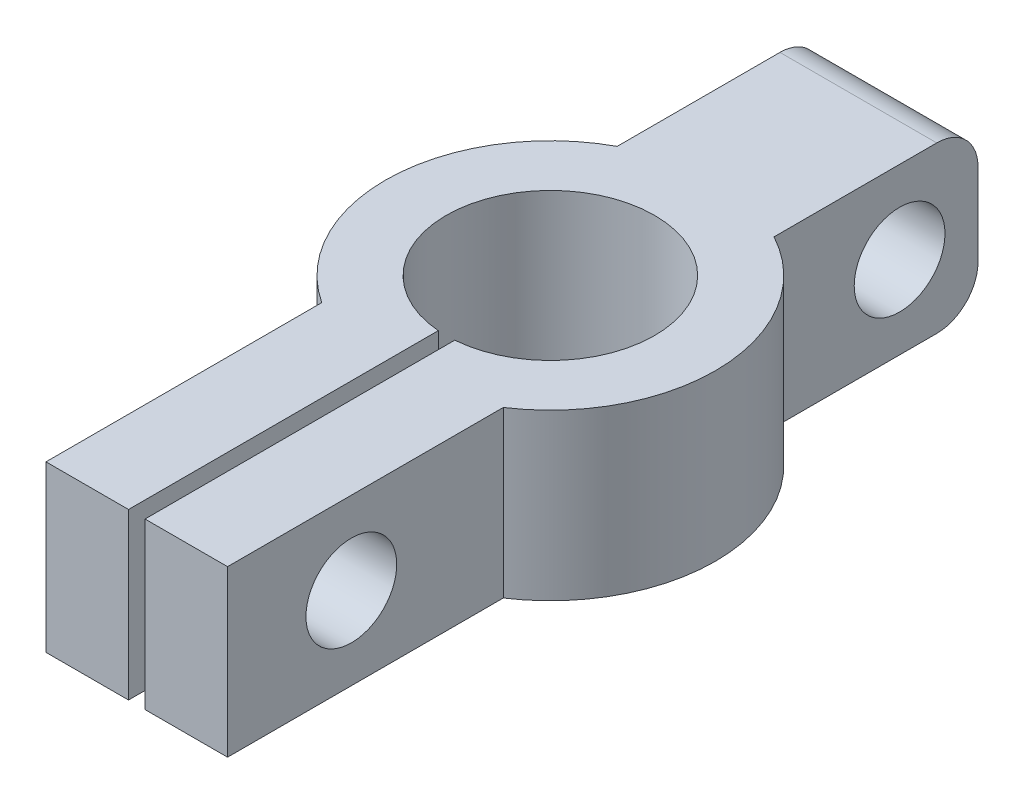
ISO-10303-21;
HEADER;
FILE_DESCRIPTION(('STEP AP214'),'2;1');
FILE_NAME('part.step','',(''),(''),'','','');
FILE_SCHEMA(('AUTOMOTIVE_DESIGN { 1 0 10303 214 1 1 1 1 }'));
ENDSEC;
DATA;
#1=APPLICATION_CONTEXT('core data for automotive mechanical design processes');
#2=APPLICATION_PROTOCOL_DEFINITION('international standard','automotive_design',2000,#1);
#3=PRODUCT_CONTEXT('',#1,'mechanical');
#4=PRODUCT('Part','Part','',(#3));
#5=PRODUCT_RELATED_PRODUCT_CATEGORY('part','',(#4));
#6=PRODUCT_DEFINITION_FORMATION('','',#4);
#7=PRODUCT_DEFINITION_CONTEXT('part definition',#1,'design');
#8=PRODUCT_DEFINITION('design','',#6,#7);
#9=PRODUCT_DEFINITION_SHAPE('','',#8);
#10=(LENGTH_UNIT() NAMED_UNIT(*) SI_UNIT(.MILLI.,.METRE.));
#11=(NAMED_UNIT(*) PLANE_ANGLE_UNIT() SI_UNIT($,.RADIAN.));
#12=(NAMED_UNIT(*) SI_UNIT($,.STERADIAN.) SOLID_ANGLE_UNIT());
#13=UNCERTAINTY_MEASURE_WITH_UNIT(LENGTH_MEASURE(1.E-05),#10,'distance_accuracy_value','');
#14=(GEOMETRIC_REPRESENTATION_CONTEXT(3) GLOBAL_UNCERTAINTY_ASSIGNED_CONTEXT((#13)) GLOBAL_UNIT_ASSIGNED_CONTEXT((#10,
#11,#12)) REPRESENTATION_CONTEXT('',''));
#15=CARTESIAN_POINT('',(0.,0.,0.));
#16=DIRECTION('',(0.,0.,1.));
#17=DIRECTION('',(1.,0.,0.));
#18=AXIS2_PLACEMENT_3D('',#15,#16,#17);
#19=CARTESIAN_POINT('',(-2.55711710439935,4.,0.));
#20=DIRECTION('',(-1.,0.,0.));
#21=DIRECTION('',(0.,0.,1.));
#22=AXIS2_PLACEMENT_3D('',#19,#20,#21);
#23=PLANE('',#22);
#24=CARTESIAN_POINT('',(-2.55711710439935,2.,-20.1393028746529));
#25=DIRECTION('',(-1.,0.,0.));
#26=DIRECTION('',(0.,0.,1.));
#27=AXIS2_PLACEMENT_3D('',#24,#25,#26);
#28=CIRCLE('',#27,1.1);
#29=CARTESIAN_POINT('',(-2.55711710439935,2.,-19.0393028746529));
#30=VERTEX_POINT('',#29);
#31=EDGE_CURVE('E190',#30,#30,#28,.T.);
#32=ORIENTED_EDGE('',*,*,#31,.T.);
#33=EDGE_LOOP('',(#32));
#34=FACE_BOUND('',#33,.T.);
#35=DIRECTION('',(0.,0.,-1.));
#36=VECTOR('',#35,1.);
#37=CARTESIAN_POINT('',(-2.55711710439935,0.,0.));
#38=LINE('',#37,#36);
#39=CARTESIAN_POINT('',(-2.55711710439935,0.,-17.0951444408748));
#40=VERTEX_POINT('',#39);
#41=CARTESIAN_POINT('',(-2.55711710439935,0.,-21.0393028746529));
#42=VERTEX_POINT('',#41);
#43=EDGE_CURVE('E187',#40,#42,#38,.T.);
#44=ORIENTED_EDGE('',*,*,#43,.T.);
#45=CARTESIAN_POINT('',(-2.55711710439935,1.,-21.0393028746529));
#46=DIRECTION('',(-1.,0.,0.));
#47=DIRECTION('',(0.,0.,1.));
#48=AXIS2_PLACEMENT_3D('',#45,#46,#47);
#49=CIRCLE('',#48,1.);
#50=CARTESIAN_POINT('',(-2.55711710439935,1.,-22.0393028746529));
#51=VERTEX_POINT('',#50);
#52=EDGE_CURVE('E251',#42,#51,#49,.F.);
#53=ORIENTED_EDGE('',*,*,#52,.T.);
#54=DIRECTION('',(0.,-1.,0.));
#55=VECTOR('',#54,1.);
#56=CARTESIAN_POINT('',(-2.55711710439935,4.,-22.0393028746529));
#57=LINE('',#56,#55);
#58=CARTESIAN_POINT('',(-2.55711710439935,3.,-22.0393028746529));
#59=VERTEX_POINT('',#58);
#60=EDGE_CURVE('E235',#59,#51,#57,.T.);
#61=ORIENTED_EDGE('',*,*,#60,.F.);
#62=CARTESIAN_POINT('',(-2.55711710439935,3.,-21.0393028746529));
#63=DIRECTION('',(-1.,0.,0.));
#64=DIRECTION('',(0.,0.,1.));
#65=AXIS2_PLACEMENT_3D('',#62,#63,#64);
#66=CIRCLE('',#65,1.);
#67=CARTESIAN_POINT('',(-2.55711710439935,4.,-21.0393028746529));
#68=VERTEX_POINT('',#67);
#69=EDGE_CURVE('E249',#59,#68,#66,.F.);
#70=ORIENTED_EDGE('',*,*,#69,.T.);
#71=DIRECTION('',(0.,0.,-1.));
#72=VECTOR('',#71,1.);
#73=CARTESIAN_POINT('',(-2.55711710439935,4.,0.));
#74=LINE('',#73,#72);
#75=CARTESIAN_POINT('',(-2.55711710439935,4.,-17.0951444408748));
#76=VERTEX_POINT('',#75);
#77=EDGE_CURVE('E150',#76,#68,#74,.T.);
#78=ORIENTED_EDGE('',*,*,#77,.F.);
#79=DIRECTION('',(0.,-1.,0.));
#80=VECTOR('',#79,1.);
#81=CARTESIAN_POINT('',(-2.55711710439935,4.,-17.0951444408748));
#82=LINE('',#81,#80);
#83=EDGE_CURVE('E186',#76,#40,#82,.T.);
#84=ORIENTED_EDGE('',*,*,#83,.T.);
#85=EDGE_LOOP('',(#44,#53,#61,#70,#78,#84));
#86=FACE_BOUND('',#85,.T.);
#87=ADVANCED_FACE('F43',(#34,#86),#23,.F.);
#88=CARTESIAN_POINT('',(0.,4.,-22.0393028746529));
#89=DIRECTION('',(0.,0.,-1.));
#90=DIRECTION('',(-1.,0.,0.));
#91=AXIS2_PLACEMENT_3D('',#88,#89,#90);
#92=PLANE('',#91);
#93=ORIENTED_EDGE('',*,*,#60,.T.);
#94=DIRECTION('',(1.,0.,0.));
#95=VECTOR('',#94,1.);
#96=CARTESIAN_POINT('',(-6.35711710439935,1.,-22.0393028746529));
#97=LINE('',#96,#95);
#98=CARTESIAN_POINT('',(-6.35711710439935,1.,-22.0393028746529));
#99=VERTEX_POINT('',#98);
#100=EDGE_CURVE('E64',#51,#99,#97,.F.);
#101=ORIENTED_EDGE('',*,*,#100,.T.);
#102=DIRECTION('',(0.,-1.,0.));
#103=VECTOR('',#102,1.);
#104=CARTESIAN_POINT('',(-6.35711710439935,4.,-22.0393028746529));
#105=LINE('',#104,#103);
#106=CARTESIAN_POINT('',(-6.35711710439935,3.,-22.0393028746529));
#107=VERTEX_POINT('',#106);
#108=EDGE_CURVE('E159',#107,#99,#105,.T.);
#109=ORIENTED_EDGE('',*,*,#108,.F.);
#110=DIRECTION('',(1.,0.,0.));
#111=VECTOR('',#110,1.);
#112=CARTESIAN_POINT('',(0.,3.,-22.0393028746529));
#113=LINE('',#112,#111);
#114=EDGE_CURVE('E253',#107,#59,#113,.T.);
#115=ORIENTED_EDGE('',*,*,#114,.T.);
#116=EDGE_LOOP('',(#93,#101,#109,#115));
#117=FACE_BOUND('',#116,.T.);
#118=ADVANCED_FACE('F268',(#117),#92,.T.);
#119=CARTESIAN_POINT('',(-6.35711710439935,4.,0.));
#120=DIRECTION('',(1.,0.,0.));
#121=DIRECTION('',(0.,0.,-1.));
#122=AXIS2_PLACEMENT_3D('',#119,#120,#121);
#123=PLANE('',#122);
#124=CARTESIAN_POINT('',(-6.35711710439935,2.,-20.1393028746529));
#125=DIRECTION('',(1.,0.,0.));
#126=DIRECTION('',(0.,0.,-1.));
#127=AXIS2_PLACEMENT_3D('',#124,#125,#126);
#128=CIRCLE('',#127,1.1);
#129=CARTESIAN_POINT('',(-6.35711710439935,2.,-21.2393028746529));
#130=VERTEX_POINT('',#129);
#131=EDGE_CURVE('E238',#130,#130,#128,.T.);
#132=ORIENTED_EDGE('',*,*,#131,.T.);
#133=EDGE_LOOP('',(#132));
#134=FACE_BOUND('',#133,.T.);
#135=ORIENTED_EDGE('',*,*,#108,.T.);
#136=CARTESIAN_POINT('',(-6.35711710439935,1.,-21.0393028746529));
#137=DIRECTION('',(1.,0.,0.));
#138=DIRECTION('',(0.,0.,-1.));
#139=AXIS2_PLACEMENT_3D('',#136,#137,#138);
#140=CIRCLE('',#139,1.);
#141=CARTESIAN_POINT('',(-6.35711710439935,0.,-21.0393028746529));
#142=VERTEX_POINT('',#141);
#143=EDGE_CURVE('E51',#99,#142,#140,.F.);
#144=ORIENTED_EDGE('',*,*,#143,.T.);
#145=DIRECTION('',(0.,0.,1.));
#146=VECTOR('',#145,1.);
#147=CARTESIAN_POINT('',(-6.35711710439935,0.,0.));
#148=LINE('',#147,#146);
#149=CARTESIAN_POINT('',(-6.35711710439935,0.,-17.0951444408748));
#150=VERTEX_POINT('',#149);
#151=EDGE_CURVE('E156',#142,#150,#148,.T.);
#152=ORIENTED_EDGE('',*,*,#151,.T.);
#153=DIRECTION('',(0.,-1.,0.));
#154=VECTOR('',#153,1.);
#155=CARTESIAN_POINT('',(-6.35711710439935,4.,-17.0951444408748));
#156=LINE('',#155,#154);
#157=CARTESIAN_POINT('',(-6.35711710439935,4.,-17.0951444408748));
#158=VERTEX_POINT('',#157);
#159=EDGE_CURVE('E153',#158,#150,#156,.T.);
#160=ORIENTED_EDGE('',*,*,#159,.F.);
#161=DIRECTION('',(0.,0.,1.));
#162=VECTOR('',#161,1.);
#163=CARTESIAN_POINT('',(-6.35711710439935,4.,0.));
#164=LINE('',#163,#162);
#165=CARTESIAN_POINT('',(-6.35711710439935,4.,-21.0393028746529));
#166=VERTEX_POINT('',#165);
#167=EDGE_CURVE('E142',#166,#158,#164,.T.);
#168=ORIENTED_EDGE('',*,*,#167,.F.);
#169=CARTESIAN_POINT('',(-6.35711710439935,3.,-21.0393028746529));
#170=DIRECTION('',(1.,0.,0.));
#171=DIRECTION('',(0.,0.,-1.));
#172=AXIS2_PLACEMENT_3D('',#169,#170,#171);
#173=CIRCLE('',#172,1.);
#174=EDGE_CURVE('E257',#166,#107,#173,.F.);
#175=ORIENTED_EDGE('',*,*,#174,.T.);
#176=EDGE_LOOP('',(#135,#144,#152,#160,#168,#175));
#177=FACE_BOUND('',#176,.T.);
#178=ADVANCED_FACE('F154',(#134,#177),#123,.F.);
#179=CARTESIAN_POINT('',(-4.45711710439935,4.,-13.5752012595152));
#180=DIRECTION('',(0.,-1.,0.));
#181=DIRECTION('',(0.,0.,-1.));
#182=AXIS2_PLACEMENT_3D('',#179,#180,#181);
#183=CYLINDRICAL_SURFACE('',#182,4.);
#184=CARTESIAN_POINT('',(-4.45711710439935,0.,-13.5752012595152));
#185=DIRECTION('',(0.,1.,0.));
#186=DIRECTION('',(0.,0.,1.));
#187=AXIS2_PLACEMENT_3D('',#184,#185,#186);
#188=CIRCLE('',#187,4.);
#189=CARTESIAN_POINT('',(-6.65711710439935,0.,-10.2345426418172));
#190=VERTEX_POINT('',#189);
#191=EDGE_CURVE('E192',#150,#190,#188,.T.);
#192=ORIENTED_EDGE('',*,*,#191,.T.);
#193=DIRECTION('',(0.,-1.,0.));
#194=VECTOR('',#193,1.);
#195=CARTESIAN_POINT('',(-6.65711710439935,4.,-10.2345426418172));
#196=LINE('',#195,#194);
#197=CARTESIAN_POINT('',(-6.65711710439935,4.,-10.2345426418172));
#198=VERTEX_POINT('',#197);
#199=EDGE_CURVE('E160',#198,#190,#196,.T.);
#200=ORIENTED_EDGE('',*,*,#199,.F.);
#201=CARTESIAN_POINT('',(-4.45711710439935,4.,-13.5752012595152));
#202=DIRECTION('',(0.,1.,0.));
#203=DIRECTION('',(0.,0.,1.));
#204=AXIS2_PLACEMENT_3D('',#201,#202,#203);
#205=CIRCLE('',#204,4.);
#206=EDGE_CURVE('E146',#158,#198,#205,.T.);
#207=ORIENTED_EDGE('',*,*,#206,.F.);
#208=ORIENTED_EDGE('',*,*,#159,.T.);
#209=EDGE_LOOP('',(#192,#200,#207,#208));
#210=FACE_BOUND('',#209,.T.);
#211=ADVANCED_FACE('F162',(#210),#183,.T.);
#212=CARTESIAN_POINT('',(-6.65711710439935,4.,0.));
#213=DIRECTION('',(1.,0.,0.));
#214=DIRECTION('',(0.,0.,-1.));
#215=AXIS2_PLACEMENT_3D('',#212,#213,#214);
#216=PLANE('',#215);
#217=CARTESIAN_POINT('',(-6.65711710439935,2.,-6.55143111261298));
#218=DIRECTION('',(-1.,0.,0.));
#219=DIRECTION('',(0.,0.,1.));
#220=AXIS2_PLACEMENT_3D('',#217,#218,#219);
#221=CIRCLE('',#220,1.1);
#222=CARTESIAN_POINT('',(-6.65711710439935,2.,-5.45143111261298));
#223=VERTEX_POINT('',#222);
#224=EDGE_CURVE('E246',#223,#223,#221,.T.);
#225=ORIENTED_EDGE('',*,*,#224,.F.);
#226=EDGE_LOOP('',(#225));
#227=FACE_BOUND('',#226,.T.);
#228=DIRECTION('',(0.,0.,1.));
#229=VECTOR('',#228,1.);
#230=CARTESIAN_POINT('',(-6.65711710439935,0.,0.));
#231=LINE('',#230,#229);
#232=CARTESIAN_POINT('',(-6.65711710439935,0.,-3.55143111261298));
#233=VERTEX_POINT('',#232);
#234=EDGE_CURVE('E194',#190,#233,#231,.T.);
#235=ORIENTED_EDGE('',*,*,#234,.T.);
#236=DIRECTION('',(0.,-1.,0.));
#237=VECTOR('',#236,1.);
#238=CARTESIAN_POINT('',(-6.65711710439935,4.,-3.55143111261298));
#239=LINE('',#238,#237);
#240=CARTESIAN_POINT('',(-6.65711710439935,4.,-3.55143111261298));
#241=VERTEX_POINT('',#240);
#242=EDGE_CURVE('E230',#241,#233,#239,.T.);
#243=ORIENTED_EDGE('',*,*,#242,.F.);
#244=DIRECTION('',(0.,0.,1.));
#245=VECTOR('',#244,1.);
#246=CARTESIAN_POINT('',(-6.65711710439935,4.,0.));
#247=LINE('',#246,#245);
#248=EDGE_CURVE('E165',#198,#241,#247,.T.);
#249=ORIENTED_EDGE('',*,*,#248,.F.);
#250=ORIENTED_EDGE('',*,*,#199,.T.);
#251=EDGE_LOOP('',(#235,#243,#249,#250));
#252=FACE_BOUND('',#251,.T.);
#253=ADVANCED_FACE('F287',(#227,#252),#216,.F.);
#254=CARTESIAN_POINT('',(0.,4.,-3.55143111261298));
#255=DIRECTION('',(0.,0.,-1.));
#256=DIRECTION('',(-1.,0.,0.));
#257=AXIS2_PLACEMENT_3D('',#254,#255,#256);
#258=PLANE('',#257);
#259=DIRECTION('',(1.,0.,0.));
#260=VECTOR('',#259,1.);
#261=CARTESIAN_POINT('',(0.,0.,-3.55143111261298));
#262=LINE('',#261,#260);
#263=CARTESIAN_POINT('',(-4.65711710439935,0.,-3.55143111261298));
#264=VERTEX_POINT('',#263);
#265=EDGE_CURVE('E196',#233,#264,#262,.T.);
#266=ORIENTED_EDGE('',*,*,#265,.T.);
#267=DIRECTION('',(0.,-1.,0.));
#268=VECTOR('',#267,1.);
#269=CARTESIAN_POINT('',(-4.65711710439935,4.,-3.55143111261298));
#270=LINE('',#269,#268);
#271=CARTESIAN_POINT('',(-4.65711710439935,4.,-3.55143111261298));
#272=VERTEX_POINT('',#271);
#273=EDGE_CURVE('E227',#272,#264,#270,.T.);
#274=ORIENTED_EDGE('',*,*,#273,.F.);
#275=DIRECTION('',(1.,0.,0.));
#276=VECTOR('',#275,1.);
#277=CARTESIAN_POINT('',(0.,4.,-3.55143111261298));
#278=LINE('',#277,#276);
#279=EDGE_CURVE('E167',#241,#272,#278,.T.);
#280=ORIENTED_EDGE('',*,*,#279,.F.);
#281=ORIENTED_EDGE('',*,*,#242,.T.);
#282=EDGE_LOOP('',(#266,#274,#280,#281));
#283=FACE_BOUND('',#282,.T.);
#284=ADVANCED_FACE('F290',(#283),#258,.F.);
#285=CARTESIAN_POINT('',(-4.65711710439935,4.,0.));
#286=DIRECTION('',(-1.,0.,0.));
#287=DIRECTION('',(0.,0.,1.));
#288=AXIS2_PLACEMENT_3D('',#285,#286,#287);
#289=PLANE('',#288);
#290=CARTESIAN_POINT('',(-4.65711710439935,2.,-6.55143111261298));
#291=DIRECTION('',(-1.,0.,0.));
#292=DIRECTION('',(0.,0.,1.));
#293=AXIS2_PLACEMENT_3D('',#290,#291,#292);
#294=CIRCLE('',#293,1.1);
#295=CARTESIAN_POINT('',(-4.65711710439935,2.,-5.45143111261298));
#296=VERTEX_POINT('',#295);
#297=EDGE_CURVE('E241',#296,#296,#294,.T.);
#298=ORIENTED_EDGE('',*,*,#297,.T.);
#299=EDGE_LOOP('',(#298));
#300=FACE_BOUND('',#299,.T.);
#301=DIRECTION('',(0.,0.,-1.));
#302=VECTOR('',#301,1.);
#303=CARTESIAN_POINT('',(-4.65711710439935,0.,0.));
#304=LINE('',#303,#302);
#305=CARTESIAN_POINT('',(-4.65711710439935,0.,-11.0581345142738));
#306=VERTEX_POINT('',#305);
#307=EDGE_CURVE('E198',#264,#306,#304,.T.);
#308=ORIENTED_EDGE('',*,*,#307,.T.);
#309=DIRECTION('',(0.,-1.,0.));
#310=VECTOR('',#309,1.);
#311=CARTESIAN_POINT('',(-4.65711710439935,4.,-11.0581345142738));
#312=LINE('',#311,#310);
#313=CARTESIAN_POINT('',(-4.65711710439935,4.,-11.0581345142738));
#314=VERTEX_POINT('',#313);
#315=EDGE_CURVE('E225',#314,#306,#312,.T.);
#316=ORIENTED_EDGE('',*,*,#315,.F.);
#317=DIRECTION('',(0.,0.,-1.));
#318=VECTOR('',#317,1.);
#319=CARTESIAN_POINT('',(-4.65711710439935,4.,0.));
#320=LINE('',#319,#318);
#321=EDGE_CURVE('E172',#272,#314,#320,.T.);
#322=ORIENTED_EDGE('',*,*,#321,.F.);
#323=ORIENTED_EDGE('',*,*,#273,.T.);
#324=EDGE_LOOP('',(#308,#316,#322,#323));
#325=FACE_BOUND('',#324,.T.);
#326=ADVANCED_FACE('F301',(#300,#325),#289,.F.);
#327=CARTESIAN_POINT('',(-4.45711710439935,4.,-13.5752012595152));
#328=DIRECTION('',(0.,-1.,0.));
#329=DIRECTION('',(0.,0.,-1.));
#330=AXIS2_PLACEMENT_3D('',#327,#328,#329);
#331=CYLINDRICAL_SURFACE('',#330,2.525);
#332=CARTESIAN_POINT('',(-4.45711710439935,0.,-13.5752012595152));
#333=DIRECTION('',(0.,1.,0.));
#334=DIRECTION('',(0.,0.,1.));
#335=AXIS2_PLACEMENT_3D('',#332,#333,#334);
#336=CIRCLE('',#335,2.525);
#337=CARTESIAN_POINT('',(-4.25711710439935,0.,-11.0581345142738));
#338=VERTEX_POINT('',#337);
#339=EDGE_CURVE('E201',#338,#306,#336,.T.);
#340=ORIENTED_EDGE('',*,*,#339,.F.);
#341=DIRECTION('',(0.,-1.,0.));
#342=VECTOR('',#341,1.);
#343=CARTESIAN_POINT('',(-4.25711710439935,4.,-11.0581345142738));
#344=LINE('',#343,#342);
#345=CARTESIAN_POINT('',(-4.25711710439935,4.,-11.0581345142738));
#346=VERTEX_POINT('',#345);
#347=EDGE_CURVE('E223',#346,#338,#344,.T.);
#348=ORIENTED_EDGE('',*,*,#347,.F.);
#349=CARTESIAN_POINT('',(-4.45711710439935,4.,-13.5752012595152));
#350=DIRECTION('',(0.,1.,0.));
#351=DIRECTION('',(0.,0.,1.));
#352=AXIS2_PLACEMENT_3D('',#349,#350,#351);
#353=CIRCLE('',#352,2.525);
#354=EDGE_CURVE('E174',#346,#314,#353,.T.);
#355=ORIENTED_EDGE('',*,*,#354,.T.);
#356=ORIENTED_EDGE('',*,*,#315,.T.);
#357=EDGE_LOOP('',(#340,#348,#355,#356));
#358=FACE_BOUND('',#357,.T.);
#359=ADVANCED_FACE('F416',(#358),#331,.F.);
#360=CARTESIAN_POINT('',(-4.25711710439935,4.,0.));
#361=DIRECTION('',(-1.,0.,0.));
#362=DIRECTION('',(0.,0.,1.));
#363=AXIS2_PLACEMENT_3D('',#360,#361,#362);
#364=PLANE('',#363);
#365=CARTESIAN_POINT('',(-4.25711710439935,2.,-6.55143111261298));
#366=DIRECTION('',(-1.,0.,0.));
#367=DIRECTION('',(0.,0.,1.));
#368=AXIS2_PLACEMENT_3D('',#365,#366,#367);
#369=CIRCLE('',#368,1.1);
#370=CARTESIAN_POINT('',(-4.25711710439935,2.,-5.45143111261298));
#371=VERTEX_POINT('',#370);
#372=EDGE_CURVE('E245',#371,#371,#369,.T.);
#373=ORIENTED_EDGE('',*,*,#372,.F.);
#374=EDGE_LOOP('',(#373));
#375=FACE_BOUND('',#374,.T.);
#376=DIRECTION('',(0.,0.,-1.));
#377=VECTOR('',#376,1.);
#378=CARTESIAN_POINT('',(-4.25711710439935,0.,0.));
#379=LINE('',#378,#377);
#380=CARTESIAN_POINT('',(-4.25711710439935,0.,-3.55143111261298));
#381=VERTEX_POINT('',#380);
#382=EDGE_CURVE('E204',#381,#338,#379,.T.);
#383=ORIENTED_EDGE('',*,*,#382,.F.);
#384=DIRECTION('',(0.,-1.,0.));
#385=VECTOR('',#384,1.);
#386=CARTESIAN_POINT('',(-4.25711710439935,4.,-3.55143111261298));
#387=LINE('',#386,#385);
#388=CARTESIAN_POINT('',(-4.25711710439935,4.,-3.55143111261298));
#389=VERTEX_POINT('',#388);
#390=EDGE_CURVE('E221',#389,#381,#387,.T.);
#391=ORIENTED_EDGE('',*,*,#390,.F.);
#392=DIRECTION('',(0.,0.,-1.));
#393=VECTOR('',#392,1.);
#394=CARTESIAN_POINT('',(-4.25711710439935,4.,0.));
#395=LINE('',#394,#393);
#396=EDGE_CURVE('E177',#389,#346,#395,.T.);
#397=ORIENTED_EDGE('',*,*,#396,.T.);
#398=ORIENTED_EDGE('',*,*,#347,.T.);
#399=EDGE_LOOP('',(#383,#391,#397,#398));
#400=FACE_BOUND('',#399,.T.);
#401=ADVANCED_FACE('F308',(#375,#400),#364,.T.);
#402=CARTESIAN_POINT('',(0.,4.,-3.55143111261298));
#403=DIRECTION('',(0.,0.,-1.));
#404=DIRECTION('',(-1.,0.,0.));
#405=AXIS2_PLACEMENT_3D('',#402,#403,#404);
#406=PLANE('',#405);
#407=DIRECTION('',(1.,0.,0.));
#408=VECTOR('',#407,1.);
#409=CARTESIAN_POINT('',(0.,0.,-3.55143111261298));
#410=LINE('',#409,#408);
#411=CARTESIAN_POINT('',(-2.25711710439935,0.,-3.55143111261298));
#412=VERTEX_POINT('',#411);
#413=EDGE_CURVE('E207',#381,#412,#410,.T.);
#414=ORIENTED_EDGE('',*,*,#413,.T.);
#415=DIRECTION('',(0.,-1.,0.));
#416=VECTOR('',#415,1.);
#417=CARTESIAN_POINT('',(-2.25711710439935,4.,-3.55143111261298));
#418=LINE('',#417,#416);
#419=CARTESIAN_POINT('',(-2.25711710439935,4.,-3.55143111261298));
#420=VERTEX_POINT('',#419);
#421=EDGE_CURVE('E218',#420,#412,#418,.T.);
#422=ORIENTED_EDGE('',*,*,#421,.F.);
#423=DIRECTION('',(1.,0.,0.));
#424=VECTOR('',#423,1.);
#425=CARTESIAN_POINT('',(0.,4.,-3.55143111261298));
#426=LINE('',#425,#424);
#427=EDGE_CURVE('E180',#389,#420,#426,.T.);
#428=ORIENTED_EDGE('',*,*,#427,.F.);
#429=ORIENTED_EDGE('',*,*,#390,.T.);
#430=EDGE_LOOP('',(#414,#422,#428,#429));
#431=FACE_BOUND('',#430,.T.);
#432=ADVANCED_FACE('F313',(#431),#406,.F.);
#433=CARTESIAN_POINT('',(-2.25711710439935,4.,0.));
#434=DIRECTION('',(-1.,0.,0.));
#435=DIRECTION('',(0.,0.,1.));
#436=AXIS2_PLACEMENT_3D('',#433,#434,#435);
#437=PLANE('',#436);
#438=CARTESIAN_POINT('',(-2.25711710439935,2.,-6.55143111261298));
#439=DIRECTION('',(-1.,0.,0.));
#440=DIRECTION('',(0.,0.,1.));
#441=AXIS2_PLACEMENT_3D('',#438,#439,#440);
#442=CIRCLE('',#441,1.1);
#443=CARTESIAN_POINT('',(-2.25711710439935,2.,-5.45143111261298));
#444=VERTEX_POINT('',#443);
#445=EDGE_CURVE('E242',#444,#444,#442,.T.);
#446=ORIENTED_EDGE('',*,*,#445,.T.);
#447=EDGE_LOOP('',(#446));
#448=FACE_BOUND('',#447,.T.);
#449=DIRECTION('',(0.,0.,-1.));
#450=VECTOR('',#449,1.);
#451=CARTESIAN_POINT('',(-2.25711710439935,0.,0.));
#452=LINE('',#451,#450);
#453=CARTESIAN_POINT('',(-2.25711710439935,0.,-10.2345426418172));
#454=VERTEX_POINT('',#453);
#455=EDGE_CURVE('E209',#412,#454,#452,.T.);
#456=ORIENTED_EDGE('',*,*,#455,.T.);
#457=DIRECTION('',(0.,-1.,0.));
#458=VECTOR('',#457,1.);
#459=CARTESIAN_POINT('',(-2.25711710439935,4.,-10.2345426418172));
#460=LINE('',#459,#458);
#461=CARTESIAN_POINT('',(-2.25711710439935,4.,-10.2345426418172));
#462=VERTEX_POINT('',#461);
#463=EDGE_CURVE('E215',#462,#454,#460,.T.);
#464=ORIENTED_EDGE('',*,*,#463,.F.);
#465=DIRECTION('',(0.,0.,-1.));
#466=VECTOR('',#465,1.);
#467=CARTESIAN_POINT('',(-2.25711710439935,4.,0.));
#468=LINE('',#467,#466);
#469=EDGE_CURVE('E182',#420,#462,#468,.T.);
#470=ORIENTED_EDGE('',*,*,#469,.F.);
#471=ORIENTED_EDGE('',*,*,#421,.T.);
#472=EDGE_LOOP('',(#456,#464,#470,#471));
#473=FACE_BOUND('',#472,.T.);
#474=ADVANCED_FACE('F317',(#448,#473),#437,.F.);
#475=CARTESIAN_POINT('',(-4.45711710439935,4.,-13.5752012595152));
#476=DIRECTION('',(0.,-1.,0.));
#477=DIRECTION('',(0.,0.,-1.));
#478=AXIS2_PLACEMENT_3D('',#475,#476,#477);
#479=CYLINDRICAL_SURFACE('',#478,4.00000000000001);
#480=CARTESIAN_POINT('',(-4.45711710439935,0.,-13.5752012595152));
#481=DIRECTION('',(0.,1.,0.));
#482=DIRECTION('',(0.,0.,1.));
#483=AXIS2_PLACEMENT_3D('',#480,#481,#482);
#484=CIRCLE('',#483,4.00000000000001);
#485=EDGE_CURVE('E211',#454,#40,#484,.T.);
#486=ORIENTED_EDGE('',*,*,#485,.T.);
#487=ORIENTED_EDGE('',*,*,#83,.F.);
#488=CARTESIAN_POINT('',(-4.45711710439935,4.,-13.5752012595152));
#489=DIRECTION('',(0.,1.,0.));
#490=DIRECTION('',(0.,0.,1.));
#491=AXIS2_PLACEMENT_3D('',#488,#489,#490);
#492=CIRCLE('',#491,4.00000000000001);
#493=EDGE_CURVE('E184',#462,#76,#492,.T.);
#494=ORIENTED_EDGE('',*,*,#493,.F.);
#495=ORIENTED_EDGE('',*,*,#463,.T.);
#496=EDGE_LOOP('',(#486,#487,#494,#495));
#497=FACE_BOUND('',#496,.T.);
#498=ADVANCED_FACE('F321',(#497),#479,.T.);
#499=CARTESIAN_POINT('',(0.,4.,0.));
#500=DIRECTION('',(0.,1.,0.));
#501=DIRECTION('',(0.,0.,1.));
#502=AXIS2_PLACEMENT_3D('',#499,#500,#501);
#503=PLANE('',#502);
#504=ORIENTED_EDGE('',*,*,#77,.T.);
#505=DIRECTION('',(1.,0.,0.));
#506=VECTOR('',#505,1.);
#507=CARTESIAN_POINT('',(0.,4.,-21.0393028746529));
#508=LINE('',#507,#506);
#509=EDGE_CURVE('E11',#68,#166,#508,.F.);
#510=ORIENTED_EDGE('',*,*,#509,.T.);
#511=ORIENTED_EDGE('',*,*,#167,.T.);
#512=ORIENTED_EDGE('',*,*,#206,.T.);
#513=ORIENTED_EDGE('',*,*,#248,.T.);
#514=ORIENTED_EDGE('',*,*,#279,.T.);
#515=ORIENTED_EDGE('',*,*,#321,.T.);
#516=ORIENTED_EDGE('',*,*,#354,.F.);
#517=ORIENTED_EDGE('',*,*,#396,.F.);
#518=ORIENTED_EDGE('',*,*,#427,.T.);
#519=ORIENTED_EDGE('',*,*,#469,.T.);
#520=ORIENTED_EDGE('',*,*,#493,.T.);
#521=EDGE_LOOP('',(#504,#510,#511,#512,#513,#514,#515,#516,#517,#518,#519,#520));
#522=FACE_BOUND('',#521,.T.);
#523=ADVANCED_FACE('F144',(#522),#503,.T.);
#524=CARTESIAN_POINT('',(0.,0.,0.));
#525=DIRECTION('',(0.,1.,0.));
#526=DIRECTION('',(0.,0.,1.));
#527=AXIS2_PLACEMENT_3D('',#524,#525,#526);
#528=PLANE('',#527);
#529=ORIENTED_EDGE('',*,*,#151,.F.);
#530=DIRECTION('',(1.,0.,0.));
#531=VECTOR('',#530,1.);
#532=CARTESIAN_POINT('',(-2.55711710439935,0.,-21.0393028746529));
#533=LINE('',#532,#531);
#534=EDGE_CURVE('E237',#142,#42,#533,.T.);
#535=ORIENTED_EDGE('',*,*,#534,.T.);
#536=ORIENTED_EDGE('',*,*,#43,.F.);
#537=ORIENTED_EDGE('',*,*,#485,.F.);
#538=ORIENTED_EDGE('',*,*,#455,.F.);
#539=ORIENTED_EDGE('',*,*,#413,.F.);
#540=ORIENTED_EDGE('',*,*,#382,.T.);
#541=ORIENTED_EDGE('',*,*,#339,.T.);
#542=ORIENTED_EDGE('',*,*,#307,.F.);
#543=ORIENTED_EDGE('',*,*,#265,.F.);
#544=ORIENTED_EDGE('',*,*,#234,.F.);
#545=ORIENTED_EDGE('',*,*,#191,.F.);
#546=EDGE_LOOP('',(#529,#535,#536,#537,#538,#539,#540,#541,#542,#543,#544,#545));
#547=FACE_BOUND('',#546,.T.);
#548=ADVANCED_FACE('F262',(#547),#528,.F.);
#549=CARTESIAN_POINT('',(-6.45711710439935,2.,-20.1393028746529));
#550=DIRECTION('',(1.,0.,0.));
#551=DIRECTION('',(0.,0.,-1.));
#552=AXIS2_PLACEMENT_3D('',#549,#550,#551);
#553=CYLINDRICAL_SURFACE('',#552,1.1);
#554=ORIENTED_EDGE('',*,*,#131,.F.);
#555=EDGE_LOOP('',(#554));
#556=FACE_BOUND('',#555,.T.);
#557=ORIENTED_EDGE('',*,*,#31,.F.);
#558=EDGE_LOOP('',(#557));
#559=FACE_BOUND('',#558,.T.);
#560=ADVANCED_FACE('F353',(#556,#559),#553,.F.);
#561=CARTESIAN_POINT('',(-1.65711710439935,2.,-6.55143111261298));
#562=DIRECTION('',(-1.,0.,0.));
#563=DIRECTION('',(0.,0.,1.));
#564=AXIS2_PLACEMENT_3D('',#561,#562,#563);
#565=CYLINDRICAL_SURFACE('',#564,1.1);
#566=ORIENTED_EDGE('',*,*,#372,.T.);
#567=EDGE_LOOP('',(#566));
#568=FACE_BOUND('',#567,.T.);
#569=ORIENTED_EDGE('',*,*,#445,.F.);
#570=EDGE_LOOP('',(#569));
#571=FACE_BOUND('',#570,.T.);
#572=ADVANCED_FACE('F348',(#568,#571),#565,.F.);
#573=ORIENTED_EDGE('',*,*,#224,.T.);
#574=EDGE_LOOP('',(#573));
#575=FACE_BOUND('',#574,.T.);
#576=ORIENTED_EDGE('',*,*,#297,.F.);
#577=EDGE_LOOP('',(#576));
#578=FACE_BOUND('',#577,.T.);
#579=ADVANCED_FACE('F284',(#575,#578),#565,.F.);
#580=CARTESIAN_POINT('',(0.,1.,-21.0393028746529));
#581=DIRECTION('',(-1.,0.,0.));
#582=DIRECTION('',(0.,0.,1.));
#583=AXIS2_PLACEMENT_3D('',#580,#581,#582);
#584=CYLINDRICAL_SURFACE('',#583,1.);
#585=ORIENTED_EDGE('',*,*,#143,.F.);
#586=ORIENTED_EDGE('',*,*,#100,.F.);
#587=ORIENTED_EDGE('',*,*,#52,.F.);
#588=ORIENTED_EDGE('',*,*,#534,.F.);
#589=EDGE_LOOP('',(#585,#586,#587,#588));
#590=FACE_BOUND('',#589,.T.);
#591=ADVANCED_FACE('F265',(#590),#584,.T.);
#592=CARTESIAN_POINT('',(0.,3.,-21.0393028746529));
#593=DIRECTION('',(1.,0.,0.));
#594=DIRECTION('',(0.,0.,-1.));
#595=AXIS2_PLACEMENT_3D('',#592,#593,#594);
#596=CYLINDRICAL_SURFACE('',#595,1.);
#597=ORIENTED_EDGE('',*,*,#174,.F.);
#598=ORIENTED_EDGE('',*,*,#509,.F.);
#599=ORIENTED_EDGE('',*,*,#69,.F.);
#600=ORIENTED_EDGE('',*,*,#114,.F.);
#601=EDGE_LOOP('',(#597,#598,#599,#600));
#602=FACE_BOUND('',#601,.T.);
#603=ADVANCED_FACE('F45',(#602),#596,.T.);
#604=CLOSED_SHELL('',(#87,#118,#178,#211,#253,#284,#326,#359,#401,#432,#474,#498,#523,#548,#560,
#572,#579,#591,#603));
#605=MANIFOLD_SOLID_BREP('B2',#604);
#606=ADVANCED_BREP_SHAPE_REPRESENTATION('',(#18,#605),#14);
#607=SHAPE_DEFINITION_REPRESENTATION(#9,#606);
ENDSEC;
END-ISO-10303-21;
